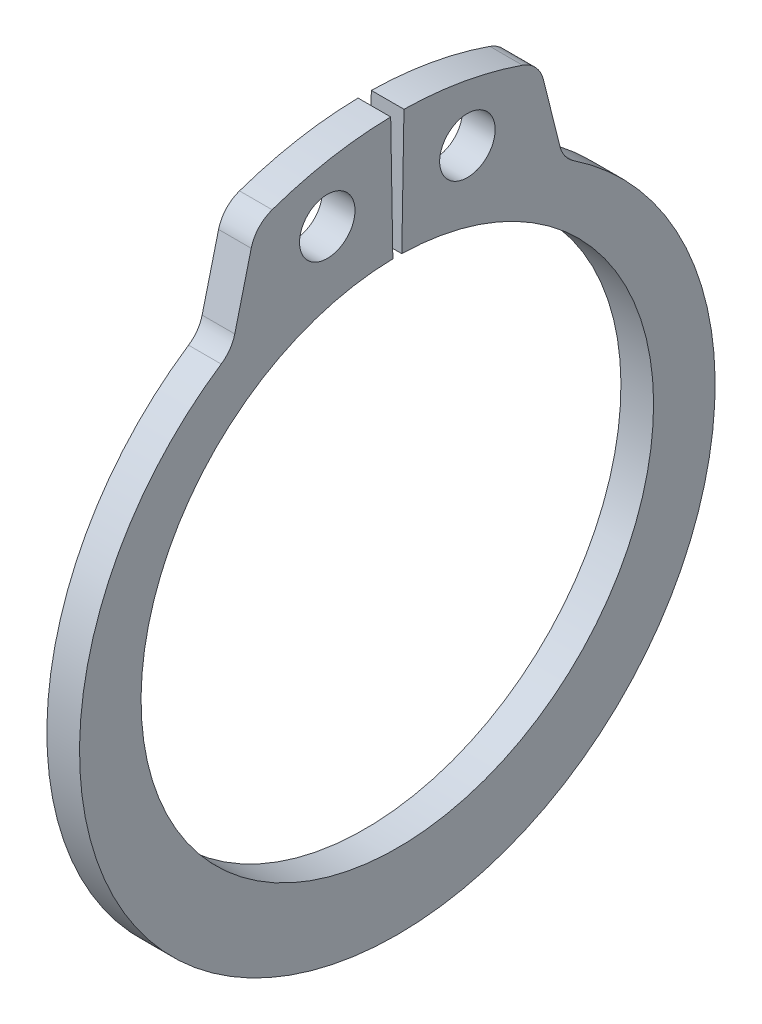
ISO-10303-21;
HEADER;
FILE_DESCRIPTION(('STEP AP214'),'2;1');
FILE_NAME('part.step','',(''),(''),'','','');
FILE_SCHEMA(('AUTOMOTIVE_DESIGN { 1 0 10303 214 1 1 1 1 }'));
ENDSEC;
DATA;
#1=APPLICATION_CONTEXT('core data for automotive mechanical design processes');
#2=APPLICATION_PROTOCOL_DEFINITION('international standard','automotive_design',2000,#1);
#3=PRODUCT_CONTEXT('',#1,'mechanical');
#4=PRODUCT('Part','Part','',(#3));
#5=PRODUCT_RELATED_PRODUCT_CATEGORY('part','',(#4));
#6=PRODUCT_DEFINITION_FORMATION('','',#4);
#7=PRODUCT_DEFINITION_CONTEXT('part definition',#1,'design');
#8=PRODUCT_DEFINITION('design','',#6,#7);
#9=PRODUCT_DEFINITION_SHAPE('','',#8);
#10=(LENGTH_UNIT() NAMED_UNIT(*) SI_UNIT(.MILLI.,.METRE.));
#11=(NAMED_UNIT(*) PLANE_ANGLE_UNIT() SI_UNIT($,.RADIAN.));
#12=(NAMED_UNIT(*) SI_UNIT($,.STERADIAN.) SOLID_ANGLE_UNIT());
#13=UNCERTAINTY_MEASURE_WITH_UNIT(LENGTH_MEASURE(1.E-05),#10,'distance_accuracy_value','');
#14=(GEOMETRIC_REPRESENTATION_CONTEXT(3) GLOBAL_UNCERTAINTY_ASSIGNED_CONTEXT((#13)) GLOBAL_UNIT_ASSIGNED_CONTEXT((#10,
#11,#12)) REPRESENTATION_CONTEXT('',''));
#15=CARTESIAN_POINT('',(0.,0.,0.));
#16=DIRECTION('',(0.,0.,1.));
#17=DIRECTION('',(1.,0.,0.));
#18=AXIS2_PLACEMENT_3D('',#15,#16,#17);
#19=CARTESIAN_POINT('',(0.5,0.,0.));
#20=DIRECTION('',(1.,0.,0.));
#21=DIRECTION('',(0.,0.,-1.));
#22=AXIS2_PLACEMENT_3D('',#19,#20,#21);
#23=PLANE('',#22);
#24=CARTESIAN_POINT('',(0.5,9.71401534481318,2.14664647590849));
#25=DIRECTION('',(1.,0.,0.));
#26=DIRECTION('',(0.,0.,-1.));
#27=AXIS2_PLACEMENT_3D('',#24,#25,#26);
#28=CIRCLE('',#27,0.85);
#29=CARTESIAN_POINT('',(0.5,9.71401534481318,1.29664647590849));
#30=VERTEX_POINT('',#29);
#31=EDGE_CURVE('E217',#30,#30,#28,.T.);
#32=ORIENTED_EDGE('',*,*,#31,.F.);
#33=EDGE_LOOP('',(#32));
#34=FACE_BOUND('',#33,.T.);
#35=CARTESIAN_POINT('',(0.5,0.,0.));
#36=DIRECTION('',(1.,0.,0.));
#37=DIRECTION('',(0.,0.,-1.));
#38=AXIS2_PLACEMENT_3D('',#35,#36,#37);
#39=CIRCLE('',#38,11.65);
#40=CARTESIAN_POINT('',(0.5,11.648225648572,0.203320534994353));
#41=VERTEX_POINT('',#40);
#42=CARTESIAN_POINT('',(0.5,11.0008869981673,3.83444719008551));
#43=VERTEX_POINT('',#42);
#44=EDGE_CURVE('E134',#41,#43,#39,.T.);
#45=ORIENTED_EDGE('',*,*,#44,.T.);
#46=CARTESIAN_POINT('',(0.5,10.0566048524018,3.50531009222409));
#47=DIRECTION('',(1.,0.,0.));
#48=DIRECTION('',(0.,0.,-1.));
#49=AXIS2_PLACEMENT_3D('',#46,#47,#48);
#50=CIRCLE('',#49,1.);
#51=CARTESIAN_POINT('',(0.5,10.2985267480015,4.47560581850009));
#52=VERTEX_POINT('',#51);
#53=EDGE_CURVE('E171',#43,#52,#50,.T.);
#54=ORIENTED_EDGE('',*,*,#53,.T.);
#55=DIRECTION('',(0.,-0.970295726275997,0.241921895599664));
#56=VECTOR('',#55,1.);
#57=CARTESIAN_POINT('',(0.5,10.8079737300043,4.34858641992285));
#58=LINE('',#57,#56);
#59=CARTESIAN_POINT('',(0.5,8.27854297548338,4.97924433827766));
#60=VERTEX_POINT('',#59);
#61=EDGE_CURVE('E209',#52,#60,#58,.T.);
#62=ORIENTED_EDGE('',*,*,#61,.T.);
#63=CARTESIAN_POINT('',(0.5,8.52046487108304,5.94954006455365));
#64=DIRECTION('',(1.,0.,0.));
#65=DIRECTION('',(0.,0.,-1.));
#66=AXIS2_PLACEMENT_3D('',#63,#64,#65);
#67=CIRCLE('',#66,1.);
#68=CARTESIAN_POINT('',(0.5,7.68809450586936,5.39532027501701));
#69=VERTEX_POINT('',#68);
#70=EDGE_CURVE('E182',#60,#69,#67,.F.);
#71=ORIENTED_EDGE('',*,*,#70,.T.);
#72=CARTESIAN_POINT('',(0.5,-0.415016917696561,0.));
#73=DIRECTION('',(1.,0.,0.));
#74=DIRECTION('',(0.,0.,-1.));
#75=AXIS2_PLACEMENT_3D('',#72,#73,#74);
#76=CIRCLE('',#75,9.73498308230344);
#77=CARTESIAN_POINT('',(0.5,7.68809450586936,-5.39532027501701));
#78=VERTEX_POINT('',#77);
#79=EDGE_CURVE('E204',#69,#78,#76,.T.);
#80=ORIENTED_EDGE('',*,*,#79,.T.);
#81=CARTESIAN_POINT('',(0.5,8.52046487108304,-5.94954006455365));
#82=DIRECTION('',(1.,0.,0.));
#83=DIRECTION('',(0.,0.,-1.));
#84=AXIS2_PLACEMENT_3D('',#81,#82,#83);
#85=CIRCLE('',#84,1.);
#86=CARTESIAN_POINT('',(0.5,8.27854297548338,-4.97924433827766));
#87=VERTEX_POINT('',#86);
#88=EDGE_CURVE('E11',#78,#87,#85,.F.);
#89=ORIENTED_EDGE('',*,*,#88,.T.);
#90=DIRECTION('',(0.,0.970295726275997,0.241921895599664));
#91=VECTOR('',#90,1.);
#92=CARTESIAN_POINT('',(0.5,10.8079737300043,-4.34858641992285));
#93=LINE('',#92,#91);
#94=CARTESIAN_POINT('',(0.5,10.2985267480015,-4.47560581850009));
#95=VERTEX_POINT('',#94);
#96=EDGE_CURVE('E203',#87,#95,#93,.T.);
#97=ORIENTED_EDGE('',*,*,#96,.T.);
#98=CARTESIAN_POINT('',(0.5,10.0566048524018,-3.50531009222409));
#99=DIRECTION('',(1.,0.,0.));
#100=DIRECTION('',(0.,0.,-1.));
#101=AXIS2_PLACEMENT_3D('',#98,#99,#100);
#102=CIRCLE('',#101,1.);
#103=CARTESIAN_POINT('',(0.5,11.0008869981673,-3.83444719008551));
#104=VERTEX_POINT('',#103);
#105=EDGE_CURVE('E49',#95,#104,#102,.T.);
#106=ORIENTED_EDGE('',*,*,#105,.T.);
#107=CARTESIAN_POINT('',(0.5,0.,0.));
#108=DIRECTION('',(1.,0.,0.));
#109=DIRECTION('',(0.,0.,1.));
#110=AXIS2_PLACEMENT_3D('',#107,#108,#109);
#111=CIRCLE('',#110,11.65);
#112=CARTESIAN_POINT('',(0.5,11.648225648572,-0.203320534994355));
#113=VERTEX_POINT('',#112);
#114=EDGE_CURVE('E206',#104,#113,#111,.T.);
#115=ORIENTED_EDGE('',*,*,#114,.T.);
#116=DIRECTION('',(0.,-0.999847695156391,0.0174524064372841));
#117=VECTOR('',#116,1.);
#118=CARTESIAN_POINT('',(0.5,11.648225648572,-0.203320534994356));
#119=LINE('',#118,#117);
#120=CARTESIAN_POINT('',(0.5,7.84880440697767,-0.137001390532676));
#121=VERTEX_POINT('',#120);
#122=EDGE_CURVE('E140',#113,#121,#119,.T.);
#123=ORIENTED_EDGE('',*,*,#122,.T.);
#124=CARTESIAN_POINT('',(0.5,0.,0.));
#125=DIRECTION('',(-1.,0.,0.));
#126=DIRECTION('',(0.,0.,-1.));
#127=AXIS2_PLACEMENT_3D('',#124,#125,#126);
#128=CIRCLE('',#127,7.85);
#129=CARTESIAN_POINT('',(0.5,7.84880440697767,0.137001390532676));
#130=VERTEX_POINT('',#129);
#131=EDGE_CURVE('E135',#121,#130,#128,.T.);
#132=ORIENTED_EDGE('',*,*,#131,.T.);
#133=DIRECTION('',(0.,0.999847695156391,0.0174524064372835));
#134=VECTOR('',#133,1.);
#135=CARTESIAN_POINT('',(0.5,7.84880440697767,0.137001390532676));
#136=LINE('',#135,#134);
#137=EDGE_CURVE('E124',#130,#41,#136,.T.);
#138=ORIENTED_EDGE('',*,*,#137,.T.);
#139=EDGE_LOOP('',(#45,#54,#62,#71,#80,#89,#97,#106,#115,#123,#132,#138));
#140=FACE_BOUND('',#139,.T.);
#141=CARTESIAN_POINT('',(0.5,9.71401534481318,-2.14664647590849));
#142=DIRECTION('',(1.,0.,0.));
#143=DIRECTION('',(0.,0.,-1.));
#144=AXIS2_PLACEMENT_3D('',#141,#142,#143);
#145=CIRCLE('',#144,0.85);
#146=CARTESIAN_POINT('',(0.5,9.71401534481318,-2.99664647590849));
#147=VERTEX_POINT('',#146);
#148=EDGE_CURVE('E246',#147,#147,#145,.T.);
#149=ORIENTED_EDGE('',*,*,#148,.F.);
#150=EDGE_LOOP('',(#149));
#151=FACE_BOUND('',#150,.T.);
#152=ADVANCED_FACE('F34',(#34,#140,#151),#23,.T.);
#153=CARTESIAN_POINT('',(-0.5,0.,0.));
#154=DIRECTION('',(1.,0.,0.));
#155=DIRECTION('',(0.,0.,-1.));
#156=AXIS2_PLACEMENT_3D('',#153,#154,#155);
#157=PLANE('',#156);
#158=CARTESIAN_POINT('',(-0.5,9.71401534481318,2.14664647590849));
#159=DIRECTION('',(1.,0.,0.));
#160=DIRECTION('',(0.,0.,-1.));
#161=AXIS2_PLACEMENT_3D('',#158,#159,#160);
#162=CIRCLE('',#161,0.85);
#163=CARTESIAN_POINT('',(-0.5,9.71401534481318,1.29664647590849));
#164=VERTEX_POINT('',#163);
#165=EDGE_CURVE('E243',#164,#164,#162,.T.);
#166=ORIENTED_EDGE('',*,*,#165,.T.);
#167=EDGE_LOOP('',(#166));
#168=FACE_BOUND('',#167,.T.);
#169=DIRECTION('',(0.,-0.970295726275997,0.241921895599664));
#170=VECTOR('',#169,1.);
#171=CARTESIAN_POINT('',(-0.5,10.8079737300043,4.34858641992285));
#172=LINE('',#171,#170);
#173=CARTESIAN_POINT('',(-0.5,10.2985267480015,4.47560581850009));
#174=VERTEX_POINT('',#173);
#175=CARTESIAN_POINT('',(-0.5,8.27854297548338,4.97924433827766));
#176=VERTEX_POINT('',#175);
#177=EDGE_CURVE('E200',#174,#176,#172,.T.);
#178=ORIENTED_EDGE('',*,*,#177,.F.);
#179=CARTESIAN_POINT('',(-0.5,10.0566048524018,3.50531009222409));
#180=DIRECTION('',(1.,0.,0.));
#181=DIRECTION('',(0.,0.,-1.));
#182=AXIS2_PLACEMENT_3D('',#179,#180,#181);
#183=CIRCLE('',#182,1.);
#184=CARTESIAN_POINT('',(-0.5,11.0008869981673,3.83444719008551));
#185=VERTEX_POINT('',#184);
#186=EDGE_CURVE('E166',#174,#185,#183,.F.);
#187=ORIENTED_EDGE('',*,*,#186,.T.);
#188=CARTESIAN_POINT('',(-0.5,0.,0.));
#189=DIRECTION('',(1.,0.,0.));
#190=DIRECTION('',(0.,0.,-1.));
#191=AXIS2_PLACEMENT_3D('',#188,#189,#190);
#192=CIRCLE('',#191,11.65);
#193=CARTESIAN_POINT('',(-0.5,11.648225648572,0.203320534994353));
#194=VERTEX_POINT('',#193);
#195=EDGE_CURVE('E219',#194,#185,#192,.T.);
#196=ORIENTED_EDGE('',*,*,#195,.F.);
#197=DIRECTION('',(0.,0.999847695156391,0.0174524064372835));
#198=VECTOR('',#197,1.);
#199=CARTESIAN_POINT('',(-0.5,7.84880440697767,0.137001390532676));
#200=LINE('',#199,#198);
#201=CARTESIAN_POINT('',(-0.5,7.84880440697767,0.137001390532676));
#202=VERTEX_POINT('',#201);
#203=EDGE_CURVE('E216',#202,#194,#200,.T.);
#204=ORIENTED_EDGE('',*,*,#203,.F.);
#205=CARTESIAN_POINT('',(-0.5,0.,0.));
#206=DIRECTION('',(-1.,0.,0.));
#207=DIRECTION('',(0.,0.,-1.));
#208=AXIS2_PLACEMENT_3D('',#205,#206,#207);
#209=CIRCLE('',#208,7.85);
#210=CARTESIAN_POINT('',(-0.5,7.84880440697767,-0.137001390532676));
#211=VERTEX_POINT('',#210);
#212=EDGE_CURVE('E148',#211,#202,#209,.T.);
#213=ORIENTED_EDGE('',*,*,#212,.F.);
#214=DIRECTION('',(0.,-0.999847695156391,0.0174524064372841));
#215=VECTOR('',#214,1.);
#216=CARTESIAN_POINT('',(-0.5,11.648225648572,-0.203320534994356));
#217=LINE('',#216,#215);
#218=CARTESIAN_POINT('',(-0.5,11.648225648572,-0.203320534994355));
#219=VERTEX_POINT('',#218);
#220=EDGE_CURVE('E144',#219,#211,#217,.T.);
#221=ORIENTED_EDGE('',*,*,#220,.F.);
#222=CARTESIAN_POINT('',(-0.5,0.,0.));
#223=DIRECTION('',(1.,0.,0.));
#224=DIRECTION('',(0.,0.,1.));
#225=AXIS2_PLACEMENT_3D('',#222,#223,#224);
#226=CIRCLE('',#225,11.65);
#227=CARTESIAN_POINT('',(-0.5,11.0008869981673,-3.83444719008551));
#228=VERTEX_POINT('',#227);
#229=EDGE_CURVE('E225',#228,#219,#226,.T.);
#230=ORIENTED_EDGE('',*,*,#229,.F.);
#231=CARTESIAN_POINT('',(-0.5,10.0566048524018,-3.50531009222409));
#232=DIRECTION('',(1.,0.,0.));
#233=DIRECTION('',(0.,0.,-1.));
#234=AXIS2_PLACEMENT_3D('',#231,#232,#233);
#235=CIRCLE('',#234,1.);
#236=CARTESIAN_POINT('',(-0.5,10.2985267480015,-4.47560581850009));
#237=VERTEX_POINT('',#236);
#238=EDGE_CURVE('E164',#228,#237,#235,.F.);
#239=ORIENTED_EDGE('',*,*,#238,.T.);
#240=DIRECTION('',(0.,0.970295726275997,0.241921895599664));
#241=VECTOR('',#240,1.);
#242=CARTESIAN_POINT('',(-0.5,10.8079737300043,-4.34858641992285));
#243=LINE('',#242,#241);
#244=CARTESIAN_POINT('',(-0.5,8.27854297548338,-4.97924433827766));
#245=VERTEX_POINT('',#244);
#246=EDGE_CURVE('E191',#245,#237,#243,.T.);
#247=ORIENTED_EDGE('',*,*,#246,.F.);
#248=CARTESIAN_POINT('',(-0.5,8.52046487108304,-5.94954006455365));
#249=DIRECTION('',(1.,0.,0.));
#250=DIRECTION('',(0.,0.,-1.));
#251=AXIS2_PLACEMENT_3D('',#248,#249,#250);
#252=CIRCLE('',#251,1.);
#253=CARTESIAN_POINT('',(-0.5,7.68809450586936,-5.39532027501701));
#254=VERTEX_POINT('',#253);
#255=EDGE_CURVE('E42',#245,#254,#252,.T.);
#256=ORIENTED_EDGE('',*,*,#255,.T.);
#257=CARTESIAN_POINT('',(-0.5,-0.415016917696561,0.));
#258=DIRECTION('',(1.,0.,0.));
#259=DIRECTION('',(0.,0.,-1.));
#260=AXIS2_PLACEMENT_3D('',#257,#258,#259);
#261=CIRCLE('',#260,9.73498308230344);
#262=CARTESIAN_POINT('',(-0.5,7.68809450586936,5.39532027501701));
#263=VERTEX_POINT('',#262);
#264=EDGE_CURVE('E190',#263,#254,#261,.T.);
#265=ORIENTED_EDGE('',*,*,#264,.F.);
#266=CARTESIAN_POINT('',(-0.5,8.52046487108304,5.94954006455365));
#267=DIRECTION('',(1.,0.,0.));
#268=DIRECTION('',(0.,0.,-1.));
#269=AXIS2_PLACEMENT_3D('',#266,#267,#268);
#270=CIRCLE('',#269,1.);
#271=EDGE_CURVE('E180',#263,#176,#270,.T.);
#272=ORIENTED_EDGE('',*,*,#271,.T.);
#273=EDGE_LOOP('',(#178,#187,#196,#204,#213,#221,#230,#239,#247,#256,#265,#272));
#274=FACE_BOUND('',#273,.T.);
#275=CARTESIAN_POINT('',(-0.5,9.71401534481318,-2.14664647590849));
#276=DIRECTION('',(1.,0.,0.));
#277=DIRECTION('',(0.,0.,-1.));
#278=AXIS2_PLACEMENT_3D('',#275,#276,#277);
#279=CIRCLE('',#278,0.85);
#280=CARTESIAN_POINT('',(-0.5,9.71401534481318,-2.99664647590849));
#281=VERTEX_POINT('',#280);
#282=EDGE_CURVE('E249',#281,#281,#279,.T.);
#283=ORIENTED_EDGE('',*,*,#282,.T.);
#284=EDGE_LOOP('',(#283));
#285=FACE_BOUND('',#284,.T.);
#286=ADVANCED_FACE('F188',(#168,#274,#285),#157,.F.);
#287=CARTESIAN_POINT('',(0.5,0.,0.));
#288=DIRECTION('',(-1.,0.,0.));
#289=DIRECTION('',(0.,0.,1.));
#290=AXIS2_PLACEMENT_3D('',#287,#288,#289);
#291=CYLINDRICAL_SURFACE('',#290,7.85);
#292=ORIENTED_EDGE('',*,*,#212,.T.);
#293=DIRECTION('',(-1.,0.,0.));
#294=VECTOR('',#293,1.);
#295=CARTESIAN_POINT('',(0.5,7.84880440697767,0.137001390532676));
#296=LINE('',#295,#294);
#297=EDGE_CURVE('E128',#130,#202,#296,.T.);
#298=ORIENTED_EDGE('',*,*,#297,.F.);
#299=ORIENTED_EDGE('',*,*,#131,.F.);
#300=DIRECTION('',(-1.,0.,0.));
#301=VECTOR('',#300,1.);
#302=CARTESIAN_POINT('',(0.5,7.84880440697767,-0.137001390532676));
#303=LINE('',#302,#301);
#304=EDGE_CURVE('E214',#121,#211,#303,.T.);
#305=ORIENTED_EDGE('',*,*,#304,.T.);
#306=EDGE_LOOP('',(#292,#298,#299,#305));
#307=FACE_BOUND('',#306,.T.);
#308=ADVANCED_FACE('F146',(#307),#291,.F.);
#309=CARTESIAN_POINT('',(0.5,7.84880440697767,0.137001390532676));
#310=DIRECTION('',(0.,-0.0174524064372835,0.999847695156391));
#311=DIRECTION('',(0.,-0.999847695156391,-0.0174524064372835));
#312=AXIS2_PLACEMENT_3D('',#309,#310,#311);
#313=PLANE('',#312);
#314=ORIENTED_EDGE('',*,*,#203,.T.);
#315=DIRECTION('',(-1.,0.,0.));
#316=VECTOR('',#315,1.);
#317=CARTESIAN_POINT('',(0.5,11.648225648572,0.203320534994353));
#318=LINE('',#317,#316);
#319=EDGE_CURVE('E131',#41,#194,#318,.T.);
#320=ORIENTED_EDGE('',*,*,#319,.F.);
#321=ORIENTED_EDGE('',*,*,#137,.F.);
#322=ORIENTED_EDGE('',*,*,#297,.T.);
#323=EDGE_LOOP('',(#314,#320,#321,#322));
#324=FACE_BOUND('',#323,.T.);
#325=ADVANCED_FACE('F126',(#324),#313,.F.);
#326=CARTESIAN_POINT('',(0.5,0.,0.));
#327=DIRECTION('',(-1.,0.,0.));
#328=DIRECTION('',(0.,0.,1.));
#329=AXIS2_PLACEMENT_3D('',#326,#327,#328);
#330=CYLINDRICAL_SURFACE('',#329,11.65);
#331=ORIENTED_EDGE('',*,*,#195,.T.);
#332=DIRECTION('',(-1.,0.,0.));
#333=VECTOR('',#332,1.);
#334=CARTESIAN_POINT('',(0.5,11.0008869981673,3.83444719008551));
#335=LINE('',#334,#333);
#336=EDGE_CURVE('E168',#185,#43,#335,.F.);
#337=ORIENTED_EDGE('',*,*,#336,.T.);
#338=ORIENTED_EDGE('',*,*,#44,.F.);
#339=ORIENTED_EDGE('',*,*,#319,.T.);
#340=EDGE_LOOP('',(#331,#337,#338,#339));
#341=FACE_BOUND('',#340,.T.);
#342=ADVANCED_FACE('F237',(#341),#330,.T.);
#343=CARTESIAN_POINT('',(0.5,10.8079737300043,4.34858641992285));
#344=DIRECTION('',(0.,-0.241921895599664,-0.970295726275997));
#345=DIRECTION('',(0.,0.970295726275997,-0.241921895599664));
#346=AXIS2_PLACEMENT_3D('',#343,#344,#345);
#347=PLANE('',#346);
#348=ORIENTED_EDGE('',*,*,#177,.T.);
#349=DIRECTION('',(1.,0.,0.));
#350=VECTOR('',#349,1.);
#351=CARTESIAN_POINT('',(0.5,8.27854297548338,4.97924433827766));
#352=LINE('',#351,#350);
#353=EDGE_CURVE('E162',#176,#60,#352,.T.);
#354=ORIENTED_EDGE('',*,*,#353,.T.);
#355=ORIENTED_EDGE('',*,*,#61,.F.);
#356=DIRECTION('',(-1.,0.,0.));
#357=VECTOR('',#356,1.);
#358=CARTESIAN_POINT('',(0.5,10.2985267480015,4.47560581850009));
#359=LINE('',#358,#357);
#360=EDGE_CURVE('E159',#52,#174,#359,.T.);
#361=ORIENTED_EDGE('',*,*,#360,.T.);
#362=EDGE_LOOP('',(#348,#354,#355,#361));
#363=FACE_BOUND('',#362,.T.);
#364=ADVANCED_FACE('F279',(#363),#347,.F.);
#365=CARTESIAN_POINT('',(0.5,-0.415016917696561,0.));
#366=DIRECTION('',(-1.,0.,0.));
#367=DIRECTION('',(0.,0.,1.));
#368=AXIS2_PLACEMENT_3D('',#365,#366,#367);
#369=CYLINDRICAL_SURFACE('',#368,9.73498308230344);
#370=ORIENTED_EDGE('',*,*,#79,.F.);
#371=DIRECTION('',(-1.,0.,0.));
#372=VECTOR('',#371,1.);
#373=CARTESIAN_POINT('',(0.5,7.68809450586936,5.39532027501701));
#374=LINE('',#373,#372);
#375=EDGE_CURVE('E151',#69,#263,#374,.T.);
#376=ORIENTED_EDGE('',*,*,#375,.T.);
#377=ORIENTED_EDGE('',*,*,#264,.T.);
#378=DIRECTION('',(-1.,0.,0.));
#379=VECTOR('',#378,1.);
#380=CARTESIAN_POINT('',(0.5,7.68809450586936,-5.39532027501701));
#381=LINE('',#380,#379);
#382=EDGE_CURVE('E149',#254,#78,#381,.F.);
#383=ORIENTED_EDGE('',*,*,#382,.T.);
#384=EDGE_LOOP('',(#370,#376,#377,#383));
#385=FACE_BOUND('',#384,.T.);
#386=ADVANCED_FACE('F197',(#385),#369,.T.);
#387=CARTESIAN_POINT('',(0.5,10.8079737300043,-4.34858641992285));
#388=DIRECTION('',(0.,-0.241921895599664,0.970295726275997));
#389=DIRECTION('',(0.,-0.970295726275997,-0.241921895599664));
#390=AXIS2_PLACEMENT_3D('',#387,#388,#389);
#391=PLANE('',#390);
#392=ORIENTED_EDGE('',*,*,#246,.T.);
#393=DIRECTION('',(-1.,0.,0.));
#394=VECTOR('',#393,1.);
#395=CARTESIAN_POINT('',(0.5,10.2985267480015,-4.47560581850009));
#396=LINE('',#395,#394);
#397=EDGE_CURVE('E57',#237,#95,#396,.F.);
#398=ORIENTED_EDGE('',*,*,#397,.T.);
#399=ORIENTED_EDGE('',*,*,#96,.F.);
#400=DIRECTION('',(1.,0.,0.));
#401=VECTOR('',#400,1.);
#402=CARTESIAN_POINT('',(-0.5,8.27854297548338,-4.97924433827766));
#403=LINE('',#402,#401);
#404=EDGE_CURVE('E176',#87,#245,#403,.F.);
#405=ORIENTED_EDGE('',*,*,#404,.T.);
#406=EDGE_LOOP('',(#392,#398,#399,#405));
#407=FACE_BOUND('',#406,.T.);
#408=ADVANCED_FACE('F205',(#407),#391,.F.);
#409=CARTESIAN_POINT('',(0.5,0.,0.));
#410=DIRECTION('',(-1.,0.,0.));
#411=DIRECTION('',(0.,0.,1.));
#412=AXIS2_PLACEMENT_3D('',#409,#410,#411);
#413=CYLINDRICAL_SURFACE('',#412,11.65);
#414=ORIENTED_EDGE('',*,*,#114,.F.);
#415=DIRECTION('',(-1.,0.,0.));
#416=VECTOR('',#415,1.);
#417=CARTESIAN_POINT('',(0.5,11.0008869981673,-3.83444719008551));
#418=LINE('',#417,#416);
#419=EDGE_CURVE('E173',#104,#228,#418,.T.);
#420=ORIENTED_EDGE('',*,*,#419,.T.);
#421=ORIENTED_EDGE('',*,*,#229,.T.);
#422=DIRECTION('',(-1.,0.,0.));
#423=VECTOR('',#422,1.);
#424=CARTESIAN_POINT('',(0.5,11.648225648572,-0.203320534994355));
#425=LINE('',#424,#423);
#426=EDGE_CURVE('E153',#113,#219,#425,.T.);
#427=ORIENTED_EDGE('',*,*,#426,.F.);
#428=EDGE_LOOP('',(#414,#420,#421,#427));
#429=FACE_BOUND('',#428,.T.);
#430=ADVANCED_FACE('F272',(#429),#413,.T.);
#431=CARTESIAN_POINT('',(0.5,11.648225648572,-0.203320534994356));
#432=DIRECTION('',(0.,-0.0174524064372841,-0.999847695156391));
#433=DIRECTION('',(0.,0.999847695156391,-0.0174524064372841));
#434=AXIS2_PLACEMENT_3D('',#431,#432,#433);
#435=PLANE('',#434);
#436=ORIENTED_EDGE('',*,*,#220,.T.);
#437=ORIENTED_EDGE('',*,*,#304,.F.);
#438=ORIENTED_EDGE('',*,*,#122,.F.);
#439=ORIENTED_EDGE('',*,*,#426,.T.);
#440=EDGE_LOOP('',(#436,#437,#438,#439));
#441=FACE_BOUND('',#440,.T.);
#442=ADVANCED_FACE('F232',(#441),#435,.F.);
#443=CARTESIAN_POINT('',(0.5,9.71401534481318,2.14664647590849));
#444=DIRECTION('',(-1.,0.,0.));
#445=DIRECTION('',(0.,0.,1.));
#446=AXIS2_PLACEMENT_3D('',#443,#444,#445);
#447=CYLINDRICAL_SURFACE('',#446,0.85);
#448=ORIENTED_EDGE('',*,*,#31,.T.);
#449=EDGE_LOOP('',(#448));
#450=FACE_BOUND('',#449,.T.);
#451=ORIENTED_EDGE('',*,*,#165,.F.);
#452=EDGE_LOOP('',(#451));
#453=FACE_BOUND('',#452,.T.);
#454=ADVANCED_FACE('F267',(#450,#453),#447,.F.);
#455=CARTESIAN_POINT('',(0.5,9.71401534481318,-2.14664647590849));
#456=DIRECTION('',(-1.,0.,0.));
#457=DIRECTION('',(0.,0.,1.));
#458=AXIS2_PLACEMENT_3D('',#455,#456,#457);
#459=CYLINDRICAL_SURFACE('',#458,0.85);
#460=ORIENTED_EDGE('',*,*,#148,.T.);
#461=EDGE_LOOP('',(#460));
#462=FACE_BOUND('',#461,.T.);
#463=ORIENTED_EDGE('',*,*,#282,.F.);
#464=EDGE_LOOP('',(#463));
#465=FACE_BOUND('',#464,.T.);
#466=ADVANCED_FACE('F255',(#462,#465),#459,.F.);
#467=CARTESIAN_POINT('',(0.5,8.52046487108304,5.94954006455365));
#468=DIRECTION('',(-1.,0.,0.));
#469=DIRECTION('',(0.,0.,1.));
#470=AXIS2_PLACEMENT_3D('',#467,#468,#469);
#471=CYLINDRICAL_SURFACE('',#470,1.);
#472=ORIENTED_EDGE('',*,*,#70,.F.);
#473=ORIENTED_EDGE('',*,*,#353,.F.);
#474=ORIENTED_EDGE('',*,*,#271,.F.);
#475=ORIENTED_EDGE('',*,*,#375,.F.);
#476=EDGE_LOOP('',(#472,#473,#474,#475));
#477=FACE_BOUND('',#476,.T.);
#478=ADVANCED_FACE('F289',(#477),#471,.F.);
#479=CARTESIAN_POINT('',(0.5,10.0566048524018,3.50531009222409));
#480=DIRECTION('',(-1.,0.,0.));
#481=DIRECTION('',(0.,0.,1.));
#482=AXIS2_PLACEMENT_3D('',#479,#480,#481);
#483=CYLINDRICAL_SURFACE('',#482,1.);
#484=ORIENTED_EDGE('',*,*,#53,.F.);
#485=ORIENTED_EDGE('',*,*,#336,.F.);
#486=ORIENTED_EDGE('',*,*,#186,.F.);
#487=ORIENTED_EDGE('',*,*,#360,.F.);
#488=EDGE_LOOP('',(#484,#485,#486,#487));
#489=FACE_BOUND('',#488,.T.);
#490=ADVANCED_FACE('F292',(#489),#483,.T.);
#491=CARTESIAN_POINT('',(0.5,10.0566048524018,-3.50531009222409));
#492=DIRECTION('',(-1.,0.,0.));
#493=DIRECTION('',(0.,0.,1.));
#494=AXIS2_PLACEMENT_3D('',#491,#492,#493);
#495=CYLINDRICAL_SURFACE('',#494,1.);
#496=ORIENTED_EDGE('',*,*,#105,.F.);
#497=ORIENTED_EDGE('',*,*,#397,.F.);
#498=ORIENTED_EDGE('',*,*,#238,.F.);
#499=ORIENTED_EDGE('',*,*,#419,.F.);
#500=EDGE_LOOP('',(#496,#497,#498,#499));
#501=FACE_BOUND('',#500,.T.);
#502=ADVANCED_FACE('F295',(#501),#495,.T.);
#503=CARTESIAN_POINT('',(0.5,8.52046487108304,-5.94954006455365));
#504=DIRECTION('',(-1.,0.,0.));
#505=DIRECTION('',(0.,0.,1.));
#506=AXIS2_PLACEMENT_3D('',#503,#504,#505);
#507=CYLINDRICAL_SURFACE('',#506,1.);
#508=ORIENTED_EDGE('',*,*,#88,.F.);
#509=ORIENTED_EDGE('',*,*,#382,.F.);
#510=ORIENTED_EDGE('',*,*,#255,.F.);
#511=ORIENTED_EDGE('',*,*,#404,.F.);
#512=EDGE_LOOP('',(#508,#509,#510,#511));
#513=FACE_BOUND('',#512,.T.);
#514=ADVANCED_FACE('F36',(#513),#507,.F.);
#515=CLOSED_SHELL('',(#152,#286,#308,#325,#342,#364,#386,#408,#430,#442,#454,#466,#478,#490,
#502,#514));
#516=MANIFOLD_SOLID_BREP('B2',#515);
#517=ADVANCED_BREP_SHAPE_REPRESENTATION('',(#18,#516),#14);
#518=SHAPE_DEFINITION_REPRESENTATION(#9,#517);
ENDSEC;
END-ISO-10303-21;
